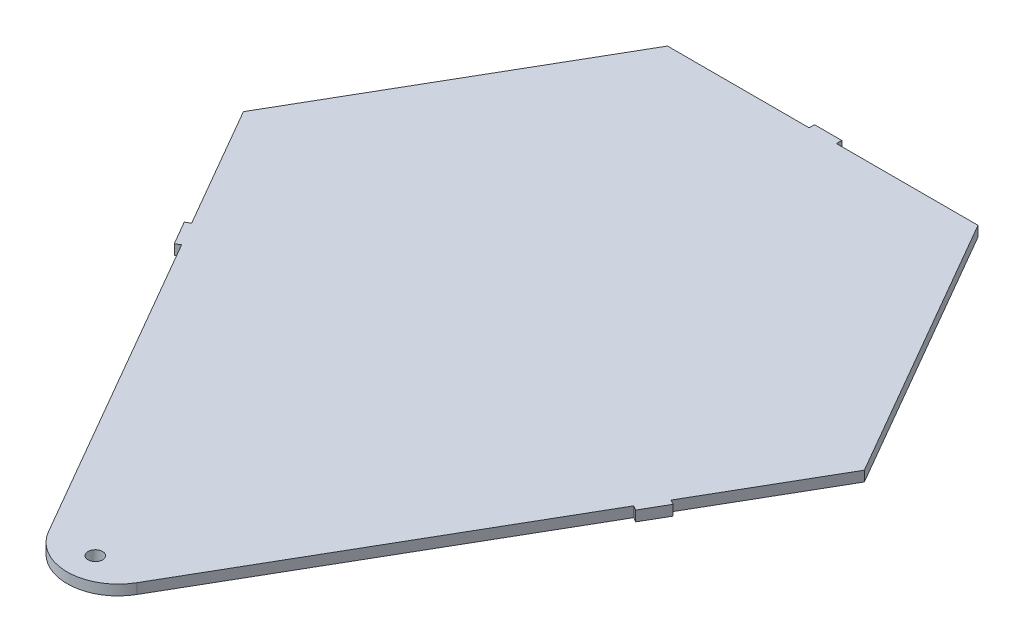
ISO-10303-21;
HEADER;
FILE_DESCRIPTION(('STEP AP214'),'2;1');
FILE_NAME('part.step','',(''),(''),'','','');
FILE_SCHEMA(('AUTOMOTIVE_DESIGN { 1 0 10303 214 1 1 1 1 }'));
ENDSEC;
DATA;
#1=APPLICATION_CONTEXT('core data for automotive mechanical design processes');
#2=APPLICATION_PROTOCOL_DEFINITION('international standard','automotive_design',2000,#1);
#3=PRODUCT_CONTEXT('',#1,'mechanical');
#4=PRODUCT('Part','Part','',(#3));
#5=PRODUCT_RELATED_PRODUCT_CATEGORY('part','',(#4));
#6=PRODUCT_DEFINITION_FORMATION('','',#4);
#7=PRODUCT_DEFINITION_CONTEXT('part definition',#1,'design');
#8=PRODUCT_DEFINITION('design','',#6,#7);
#9=PRODUCT_DEFINITION_SHAPE('','',#8);
#10=(LENGTH_UNIT() NAMED_UNIT(*) SI_UNIT(.MILLI.,.METRE.));
#11=(NAMED_UNIT(*) PLANE_ANGLE_UNIT() SI_UNIT($,.RADIAN.));
#12=(NAMED_UNIT(*) SI_UNIT($,.STERADIAN.) SOLID_ANGLE_UNIT());
#13=UNCERTAINTY_MEASURE_WITH_UNIT(LENGTH_MEASURE(1.E-05),#10,'distance_accuracy_value','');
#14=(GEOMETRIC_REPRESENTATION_CONTEXT(3) GLOBAL_UNCERTAINTY_ASSIGNED_CONTEXT((#13)) GLOBAL_UNIT_ASSIGNED_CONTEXT((#10,
#11,#12)) REPRESENTATION_CONTEXT('',''));
#15=CARTESIAN_POINT('',(0.,0.,0.));
#16=DIRECTION('',(0.,0.,1.));
#17=DIRECTION('',(1.,0.,0.));
#18=AXIS2_PLACEMENT_3D('',#15,#16,#17);
#19=CARTESIAN_POINT('',(-7.49999999999993,5.63,-147.657331345247));
#20=DIRECTION('',(0.,0.,1.));
#21=DIRECTION('',(1.,0.,0.));
#22=AXIS2_PLACEMENT_3D('',#19,#20,#21);
#23=PLANE('',#22);
#24=DIRECTION('',(-1.,0.,0.));
#25=VECTOR('',#24,1.);
#26=CARTESIAN_POINT('',(-7.49999999999993,0.,-147.657331345247));
#27=LINE('',#26,#25);
#28=CARTESIAN_POINT('',(-7.49999999999993,0.,-147.657331345247));
#29=VERTEX_POINT('',#28);
#30=CARTESIAN_POINT('',(-85.2499999999999,0.,-147.657331345247));
#31=VERTEX_POINT('',#30);
#32=EDGE_CURVE('E183',#29,#31,#27,.T.);
#33=ORIENTED_EDGE('',*,*,#32,.T.);
#34=DIRECTION('',(0.,-1.,0.));
#35=VECTOR('',#34,1.);
#36=CARTESIAN_POINT('',(-85.2499999999999,5.63,-147.657331345247));
#37=LINE('',#36,#35);
#38=CARTESIAN_POINT('',(-85.2499999999999,5.63,-147.657331345247));
#39=VERTEX_POINT('',#38);
#40=EDGE_CURVE('E164',#39,#31,#37,.T.);
#41=ORIENTED_EDGE('',*,*,#40,.F.);
#42=DIRECTION('',(-1.,0.,0.));
#43=VECTOR('',#42,1.);
#44=CARTESIAN_POINT('',(-7.49999999999993,5.63,-147.657331345247));
#45=LINE('',#44,#43);
#46=CARTESIAN_POINT('',(-7.49999999999993,5.63,-147.657331345247));
#47=VERTEX_POINT('',#46);
#48=EDGE_CURVE('E171',#47,#39,#45,.T.);
#49=ORIENTED_EDGE('',*,*,#48,.F.);
#50=DIRECTION('',(0.,-1.,0.));
#51=VECTOR('',#50,1.);
#52=CARTESIAN_POINT('',(-7.49999999999993,5.63,-147.657331345247));
#53=LINE('',#52,#51);
#54=EDGE_CURVE('E229',#47,#29,#53,.T.);
#55=ORIENTED_EDGE('',*,*,#54,.T.);
#56=EDGE_LOOP('',(#33,#41,#49,#55));
#57=FACE_BOUND('',#56,.T.);
#58=ADVANCED_FACE('F35',(#57),#23,.F.);
#59=CARTESIAN_POINT('',(-85.2499999999999,5.63,-147.657331345247));
#60=DIRECTION('',(0.866025403784438,0.,0.5));
#61=DIRECTION('',(0.5,0.,-0.866025403784438));
#62=AXIS2_PLACEMENT_3D('',#59,#60,#61);
#63=PLANE('',#62);
#64=DIRECTION('',(-0.5,0.,0.866025403784438));
#65=VECTOR('',#64,1.);
#66=CARTESIAN_POINT('',(-85.2499999999999,0.,-147.657331345247));
#67=LINE('',#66,#65);
#68=CARTESIAN_POINT('',(-170.5,0.,0.));
#69=VERTEX_POINT('',#68);
#70=EDGE_CURVE('E264',#31,#69,#67,.T.);
#71=ORIENTED_EDGE('',*,*,#70,.T.);
#72=DIRECTION('',(0.,-1.,0.));
#73=VECTOR('',#72,1.);
#74=CARTESIAN_POINT('',(-170.5,5.63,0.));
#75=LINE('',#74,#73);
#76=CARTESIAN_POINT('',(-170.5,5.63,0.));
#77=VERTEX_POINT('',#76);
#78=EDGE_CURVE('E167',#77,#69,#75,.T.);
#79=ORIENTED_EDGE('',*,*,#78,.F.);
#80=DIRECTION('',(-0.5,0.,0.866025403784438));
#81=VECTOR('',#80,1.);
#82=CARTESIAN_POINT('',(-85.2499999999999,5.63,-147.657331345247));
#83=LINE('',#82,#81);
#84=EDGE_CURVE('E160',#39,#77,#83,.T.);
#85=ORIENTED_EDGE('',*,*,#84,.F.);
#86=ORIENTED_EDGE('',*,*,#40,.T.);
#87=EDGE_LOOP('',(#71,#79,#85,#86));
#88=FACE_BOUND('',#87,.T.);
#89=ADVANCED_FACE('F162',(#88),#63,.F.);
#90=CARTESIAN_POINT('',(-170.5,5.63,0.));
#91=DIRECTION('',(0.866025403784439,0.,-0.499999999999999));
#92=DIRECTION('',(-0.499999999999999,0.,-0.866025403784439));
#93=AXIS2_PLACEMENT_3D('',#90,#91,#92);
#94=PLANE('',#93);
#95=DIRECTION('',(0.499999999999999,0.,0.866025403784439));
#96=VECTOR('',#95,1.);
#97=CARTESIAN_POINT('',(-170.5,0.,0.));
#98=LINE('',#97,#96);
#99=CARTESIAN_POINT('',(-131.650528172288,0.,67.2892590528124));
#100=VERTEX_POINT('',#99);
#101=EDGE_CURVE('E262',#69,#100,#98,.T.);
#102=ORIENTED_EDGE('',*,*,#101,.T.);
#103=DIRECTION('',(0.,-1.,0.));
#104=VECTOR('',#103,1.);
#105=CARTESIAN_POINT('',(-131.650528172288,5.63,67.2892590528124));
#106=LINE('',#105,#104);
#107=CARTESIAN_POINT('',(-131.650528172288,5.63,67.2892590528124));
#108=VERTEX_POINT('',#107);
#109=EDGE_CURVE('E188',#108,#100,#106,.T.);
#110=ORIENTED_EDGE('',*,*,#109,.F.);
#111=DIRECTION('',(0.499999999999999,0.,0.866025403784439));
#112=VECTOR('',#111,1.);
#113=CARTESIAN_POINT('',(-170.5,5.63,0.));
#114=LINE('',#113,#112);
#115=EDGE_CURVE('E170',#77,#108,#114,.T.);
#116=ORIENTED_EDGE('',*,*,#115,.F.);
#117=ORIENTED_EDGE('',*,*,#78,.T.);
#118=EDGE_LOOP('',(#102,#110,#116,#117));
#119=FACE_BOUND('',#118,.T.);
#120=ADVANCED_FACE('F332',(#119),#94,.F.);
#121=CARTESIAN_POINT('',(-131.650528172288,5.63,67.2892590528124));
#122=DIRECTION('',(0.499999999999997,0.,0.86602540378444));
#123=DIRECTION('',(0.86602540378444,0.,-0.499999999999997));
#124=AXIS2_PLACEMENT_3D('',#121,#122,#123);
#125=PLANE('',#124);
#126=DIRECTION('',(-0.86602540378444,0.,0.499999999999997));
#127=VECTOR('',#126,1.);
#128=CARTESIAN_POINT('',(-131.650528172288,0.,67.2892590528124));
#129=LINE('',#128,#127);
#130=CARTESIAN_POINT('',(-134.205303113452,0.,68.7642590528123));
#131=VERTEX_POINT('',#130);
#132=EDGE_CURVE('E260',#100,#131,#129,.T.);
#133=ORIENTED_EDGE('',*,*,#132,.T.);
#134=DIRECTION('',(0.,-1.,0.));
#135=VECTOR('',#134,1.);
#136=CARTESIAN_POINT('',(-134.205303113452,5.63,68.7642590528123));
#137=LINE('',#136,#135);
#138=CARTESIAN_POINT('',(-134.205303113452,5.63,68.7642590528123));
#139=VERTEX_POINT('',#138);
#140=EDGE_CURVE('E195',#139,#131,#137,.T.);
#141=ORIENTED_EDGE('',*,*,#140,.F.);
#142=DIRECTION('',(-0.86602540378444,0.,0.499999999999997));
#143=VECTOR('',#142,1.);
#144=CARTESIAN_POINT('',(-131.650528172288,5.63,67.2892590528124));
#145=LINE('',#144,#143);
#146=EDGE_CURVE('E294',#108,#139,#145,.T.);
#147=ORIENTED_EDGE('',*,*,#146,.F.);
#148=ORIENTED_EDGE('',*,*,#109,.T.);
#149=EDGE_LOOP('',(#133,#141,#147,#148));
#150=FACE_BOUND('',#149,.T.);
#151=ADVANCED_FACE('F337',(#150),#125,.F.);
#152=CARTESIAN_POINT('',(-134.205303113452,5.63,68.7642590528123));
#153=DIRECTION('',(0.866025403784439,0.,-0.5));
#154=DIRECTION('',(-0.5,0.,-0.866025403784439));
#155=AXIS2_PLACEMENT_3D('',#152,#153,#154);
#156=PLANE('',#155);
#157=DIRECTION('',(0.5,0.,0.866025403784439));
#158=VECTOR('',#157,1.);
#159=CARTESIAN_POINT('',(-134.205303113452,0.,68.7642590528123));
#160=LINE('',#159,#158);
#161=CARTESIAN_POINT('',(-126.705303113452,0.,81.7546401095789));
#162=VERTEX_POINT('',#161);
#163=EDGE_CURVE('E258',#131,#162,#160,.T.);
#164=ORIENTED_EDGE('',*,*,#163,.T.);
#165=DIRECTION('',(0.,-1.,0.));
#166=VECTOR('',#165,1.);
#167=CARTESIAN_POINT('',(-126.705303113452,5.63,81.7546401095789));
#168=LINE('',#167,#166);
#169=CARTESIAN_POINT('',(-126.705303113452,5.63,81.7546401095789));
#170=VERTEX_POINT('',#169);
#171=EDGE_CURVE('E198',#170,#162,#168,.T.);
#172=ORIENTED_EDGE('',*,*,#171,.F.);
#173=DIRECTION('',(0.5,0.,0.866025403784439));
#174=VECTOR('',#173,1.);
#175=CARTESIAN_POINT('',(-134.205303113452,5.63,68.7642590528123));
#176=LINE('',#175,#174);
#177=EDGE_CURVE('E292',#139,#170,#176,.T.);
#178=ORIENTED_EDGE('',*,*,#177,.F.);
#179=ORIENTED_EDGE('',*,*,#140,.T.);
#180=EDGE_LOOP('',(#164,#172,#178,#179));
#181=FACE_BOUND('',#180,.T.);
#182=ADVANCED_FACE('F341',(#181),#156,.F.);
#183=CARTESIAN_POINT('',(-126.705303113452,5.63,81.7546401095789));
#184=DIRECTION('',(-0.500000000000003,0.,-0.866025403784437));
#185=DIRECTION('',(-0.866025403784437,0.,0.500000000000003));
#186=AXIS2_PLACEMENT_3D('',#183,#184,#185);
#187=PLANE('',#186);
#188=DIRECTION('',(0.866025403784437,0.,-0.500000000000003));
#189=VECTOR('',#188,1.);
#190=CARTESIAN_POINT('',(-126.705303113452,0.,81.7546401095789));
#191=LINE('',#190,#189);
#192=CARTESIAN_POINT('',(-124.150528172288,0.,80.2796401095789));
#193=VERTEX_POINT('',#192);
#194=EDGE_CURVE('E255',#162,#193,#191,.T.);
#195=ORIENTED_EDGE('',*,*,#194,.T.);
#196=DIRECTION('',(0.,-1.,0.));
#197=VECTOR('',#196,1.);
#198=CARTESIAN_POINT('',(-124.150528172288,5.63,80.2796401095789));
#199=LINE('',#198,#197);
#200=CARTESIAN_POINT('',(-124.150528172288,5.63,80.2796401095789));
#201=VERTEX_POINT('',#200);
#202=EDGE_CURVE('E201',#201,#193,#199,.T.);
#203=ORIENTED_EDGE('',*,*,#202,.F.);
#204=DIRECTION('',(0.866025403784437,0.,-0.500000000000003));
#205=VECTOR('',#204,1.);
#206=CARTESIAN_POINT('',(-126.705303113452,5.63,81.7546401095789));
#207=LINE('',#206,#205);
#208=EDGE_CURVE('E290',#170,#201,#207,.T.);
#209=ORIENTED_EDGE('',*,*,#208,.F.);
#210=ORIENTED_EDGE('',*,*,#171,.T.);
#211=EDGE_LOOP('',(#195,#203,#209,#210));
#212=FACE_BOUND('',#211,.T.);
#213=ADVANCED_FACE('F345',(#212),#187,.F.);
#214=CARTESIAN_POINT('',(-85.2499999999848,5.63,147.657331345273));
#215=DIRECTION('',(0.866025403784438,0.,-0.5));
#216=DIRECTION('',(-0.5,0.,-0.866025403784438));
#217=AXIS2_PLACEMENT_3D('',#214,#215,#216);
#218=PLANE('',#217);
#219=DIRECTION('',(0.5,0.,0.866025403784438));
#220=VECTOR('',#219,1.);
#221=CARTESIAN_POINT('',(-85.2499999999848,0.,147.657331345273));
#222=LINE('',#221,#220);
#223=CARTESIAN_POINT('',(-24.2487113059642,0.,253.314662690493));
#224=VERTEX_POINT('',#223);
#225=EDGE_CURVE('E253',#193,#224,#222,.T.);
#226=ORIENTED_EDGE('',*,*,#225,.T.);
#227=DIRECTION('',(0.,-1.,0.));
#228=VECTOR('',#227,1.);
#229=CARTESIAN_POINT('',(-24.2487113059642,5.63,253.314662690493));
#230=LINE('',#229,#228);
#231=CARTESIAN_POINT('',(-24.2487113059641,5.63,253.314662690493));
#232=VERTEX_POINT('',#231);
#233=EDGE_CURVE('E44',#224,#232,#230,.F.);
#234=ORIENTED_EDGE('',*,*,#233,.T.);
#235=DIRECTION('',(0.500000000000002,0.,0.866025403784437));
#236=VECTOR('',#235,1.);
#237=CARTESIAN_POINT('',(-124.150528172288,5.63,80.2796401095789));
#238=LINE('',#237,#236);
#239=EDGE_CURVE('E288',#201,#232,#238,.T.);
#240=ORIENTED_EDGE('',*,*,#239,.F.);
#241=ORIENTED_EDGE('',*,*,#202,.T.);
#242=EDGE_LOOP('',(#226,#234,#240,#241));
#243=FACE_BOUND('',#242,.T.);
#244=ADVANCED_FACE('F349',(#243),#218,.F.);
#245=CARTESIAN_POINT('',(85.25,5.63,147.657331345247));
#246=DIRECTION('',(-0.866025403784438,0.,-0.500000000000001));
#247=DIRECTION('',(-0.500000000000001,0.,0.866025403784438));
#248=AXIS2_PLACEMENT_3D('',#245,#246,#247);
#249=PLANE('',#248);
#250=DIRECTION('',(-0.499999999999999,0.,0.866025403784439));
#251=VECTOR('',#250,1.);
#252=CARTESIAN_POINT('',(85.25,5.63,147.657331345247));
#253=LINE('',#252,#251);
#254=CARTESIAN_POINT('',(124.150528172288,5.63,80.2796401095789));
#255=VERTEX_POINT('',#254);
#256=CARTESIAN_POINT('',(24.2487113059645,5.63,253.314662690494));
#257=VERTEX_POINT('',#256);
#258=EDGE_CURVE('E285',#255,#257,#253,.T.);
#259=ORIENTED_EDGE('',*,*,#258,.T.);
#260=DIRECTION('',(0.,-1.,0.));
#261=VECTOR('',#260,1.);
#262=CARTESIAN_POINT('',(24.2487113059643,5.63,253.314662690493));
#263=LINE('',#262,#261);
#264=CARTESIAN_POINT('',(24.2487113059643,0.,253.314662690493));
#265=VERTEX_POINT('',#264);
#266=EDGE_CURVE('E184',#257,#265,#263,.T.);
#267=ORIENTED_EDGE('',*,*,#266,.T.);
#268=DIRECTION('',(0.500000000000001,0.,-0.866025403784438));
#269=VECTOR('',#268,1.);
#270=CARTESIAN_POINT('',(85.25,0.,147.657331345247));
#271=LINE('',#270,#269);
#272=CARTESIAN_POINT('',(124.150528172288,0.,80.2796401095789));
#273=VERTEX_POINT('',#272);
#274=EDGE_CURVE('E251',#265,#273,#271,.T.);
#275=ORIENTED_EDGE('',*,*,#274,.T.);
#276=DIRECTION('',(0.,-1.,0.));
#277=VECTOR('',#276,1.);
#278=CARTESIAN_POINT('',(124.150528172288,5.63,80.2796401095789));
#279=LINE('',#278,#277);
#280=EDGE_CURVE('E204',#255,#273,#279,.T.);
#281=ORIENTED_EDGE('',*,*,#280,.F.);
#282=EDGE_LOOP('',(#259,#267,#275,#281));
#283=FACE_BOUND('',#282,.T.);
#284=ADVANCED_FACE('F313',(#283),#249,.F.);
#285=CARTESIAN_POINT('',(124.150528172288,5.63,80.2796401095789));
#286=DIRECTION('',(0.500000000000002,0.,-0.866025403784438));
#287=DIRECTION('',(-0.866025403784438,0.,-0.500000000000002));
#288=AXIS2_PLACEMENT_3D('',#285,#286,#287);
#289=PLANE('',#288);
#290=DIRECTION('',(0.866025403784438,0.,0.500000000000002));
#291=VECTOR('',#290,1.);
#292=CARTESIAN_POINT('',(124.150528172288,0.,80.2796401095789));
#293=LINE('',#292,#291);
#294=CARTESIAN_POINT('',(126.705303113453,0.,81.7546401095789));
#295=VERTEX_POINT('',#294);
#296=EDGE_CURVE('E249',#273,#295,#293,.T.);
#297=ORIENTED_EDGE('',*,*,#296,.T.);
#298=DIRECTION('',(0.,-1.,0.));
#299=VECTOR('',#298,1.);
#300=CARTESIAN_POINT('',(126.705303113453,5.63,81.7546401095789));
#301=LINE('',#300,#299);
#302=CARTESIAN_POINT('',(126.705303113453,5.63,81.7546401095789));
#303=VERTEX_POINT('',#302);
#304=EDGE_CURVE('E207',#303,#295,#301,.T.);
#305=ORIENTED_EDGE('',*,*,#304,.F.);
#306=DIRECTION('',(0.866025403784438,0.,0.500000000000002));
#307=VECTOR('',#306,1.);
#308=CARTESIAN_POINT('',(124.150528172288,5.63,80.2796401095789));
#309=LINE('',#308,#307);
#310=EDGE_CURVE('E283',#255,#303,#309,.T.);
#311=ORIENTED_EDGE('',*,*,#310,.F.);
#312=ORIENTED_EDGE('',*,*,#280,.T.);
#313=EDGE_LOOP('',(#297,#305,#311,#312));
#314=FACE_BOUND('',#313,.T.);
#315=ADVANCED_FACE('F317',(#314),#289,.F.);
#316=CARTESIAN_POINT('',(126.705303113453,5.63,81.7546401095789));
#317=DIRECTION('',(-0.866025403784439,0.,-0.5));
#318=DIRECTION('',(-0.5,0.,0.866025403784439));
#319=AXIS2_PLACEMENT_3D('',#316,#317,#318);
#320=PLANE('',#319);
#321=DIRECTION('',(0.5,0.,-0.866025403784439));
#322=VECTOR('',#321,1.);
#323=CARTESIAN_POINT('',(126.705303113453,0.,81.7546401095789));
#324=LINE('',#323,#322);
#325=CARTESIAN_POINT('',(134.205303113453,0.,68.7642590528123));
#326=VERTEX_POINT('',#325);
#327=EDGE_CURVE('E247',#295,#326,#324,.T.);
#328=ORIENTED_EDGE('',*,*,#327,.T.);
#329=DIRECTION('',(0.,-1.,0.));
#330=VECTOR('',#329,1.);
#331=CARTESIAN_POINT('',(134.205303113453,5.63,68.7642590528123));
#332=LINE('',#331,#330);
#333=CARTESIAN_POINT('',(134.205303113453,5.63,68.7642590528123));
#334=VERTEX_POINT('',#333);
#335=EDGE_CURVE('E210',#334,#326,#332,.T.);
#336=ORIENTED_EDGE('',*,*,#335,.F.);
#337=DIRECTION('',(0.5,0.,-0.866025403784439));
#338=VECTOR('',#337,1.);
#339=CARTESIAN_POINT('',(126.705303113453,5.63,81.7546401095789));
#340=LINE('',#339,#338);
#341=EDGE_CURVE('E281',#303,#334,#340,.T.);
#342=ORIENTED_EDGE('',*,*,#341,.F.);
#343=ORIENTED_EDGE('',*,*,#304,.T.);
#344=EDGE_LOOP('',(#328,#336,#342,#343));
#345=FACE_BOUND('',#344,.T.);
#346=ADVANCED_FACE('F357',(#345),#320,.F.);
#347=CARTESIAN_POINT('',(134.205303113453,5.63,68.7642590528123));
#348=DIRECTION('',(-0.499999999999996,0.,0.866025403784441));
#349=DIRECTION('',(0.866025403784441,0.,0.499999999999996));
#350=AXIS2_PLACEMENT_3D('',#347,#348,#349);
#351=PLANE('',#350);
#352=DIRECTION('',(-0.866025403784441,0.,-0.499999999999996));
#353=VECTOR('',#352,1.);
#354=CARTESIAN_POINT('',(134.205303113453,0.,68.7642590528123));
#355=LINE('',#354,#353);
#356=CARTESIAN_POINT('',(131.650528172288,0.,67.2892590528123));
#357=VERTEX_POINT('',#356);
#358=EDGE_CURVE('E245',#326,#357,#355,.T.);
#359=ORIENTED_EDGE('',*,*,#358,.T.);
#360=DIRECTION('',(0.,-1.,0.));
#361=VECTOR('',#360,1.);
#362=CARTESIAN_POINT('',(131.650528172288,5.63,67.2892590528123));
#363=LINE('',#362,#361);
#364=CARTESIAN_POINT('',(131.650528172288,5.63,67.2892590528123));
#365=VERTEX_POINT('',#364);
#366=EDGE_CURVE('E213',#365,#357,#363,.T.);
#367=ORIENTED_EDGE('',*,*,#366,.F.);
#368=DIRECTION('',(-0.866025403784441,0.,-0.499999999999996));
#369=VECTOR('',#368,1.);
#370=CARTESIAN_POINT('',(134.205303113453,5.63,68.7642590528123));
#371=LINE('',#370,#369);
#372=EDGE_CURVE('E279',#334,#365,#371,.T.);
#373=ORIENTED_EDGE('',*,*,#372,.F.);
#374=ORIENTED_EDGE('',*,*,#335,.T.);
#375=EDGE_LOOP('',(#359,#367,#373,#374));
#376=FACE_BOUND('',#375,.T.);
#377=ADVANCED_FACE('F360',(#376),#351,.F.);
#378=CARTESIAN_POINT('',(131.650528172288,5.63,67.2892590528123));
#379=DIRECTION('',(-0.866025403784439,0.,-0.5));
#380=DIRECTION('',(-0.5,0.,0.866025403784439));
#381=AXIS2_PLACEMENT_3D('',#378,#379,#380);
#382=PLANE('',#381);
#383=DIRECTION('',(0.5,0.,-0.866025403784439));
#384=VECTOR('',#383,1.);
#385=CARTESIAN_POINT('',(131.650528172288,0.,67.2892590528123));
#386=LINE('',#385,#384);
#387=CARTESIAN_POINT('',(170.5,0.,0.));
#388=VERTEX_POINT('',#387);
#389=EDGE_CURVE('E243',#357,#388,#386,.T.);
#390=ORIENTED_EDGE('',*,*,#389,.T.);
#391=DIRECTION('',(0.,-1.,0.));
#392=VECTOR('',#391,1.);
#393=CARTESIAN_POINT('',(170.5,5.63,0.));
#394=LINE('',#393,#392);
#395=CARTESIAN_POINT('',(170.5,5.63,0.));
#396=VERTEX_POINT('',#395);
#397=EDGE_CURVE('E216',#396,#388,#394,.T.);
#398=ORIENTED_EDGE('',*,*,#397,.F.);
#399=DIRECTION('',(0.5,0.,-0.866025403784439));
#400=VECTOR('',#399,1.);
#401=CARTESIAN_POINT('',(131.650528172288,5.63,67.2892590528123));
#402=LINE('',#401,#400);
#403=EDGE_CURVE('E277',#365,#396,#402,.T.);
#404=ORIENTED_EDGE('',*,*,#403,.F.);
#405=ORIENTED_EDGE('',*,*,#366,.T.);
#406=EDGE_LOOP('',(#390,#398,#404,#405));
#407=FACE_BOUND('',#406,.T.);
#408=ADVANCED_FACE('F364',(#407),#382,.F.);
#409=CARTESIAN_POINT('',(170.5,5.63,0.));
#410=DIRECTION('',(-0.866025403784439,0.,0.5));
#411=DIRECTION('',(0.5,0.,0.866025403784439));
#412=AXIS2_PLACEMENT_3D('',#409,#410,#411);
#413=PLANE('',#412);
#414=DIRECTION('',(-0.5,0.,-0.866025403784439));
#415=VECTOR('',#414,1.);
#416=CARTESIAN_POINT('',(170.5,0.,0.));
#417=LINE('',#416,#415);
#418=CARTESIAN_POINT('',(85.2500000000001,0.,-147.657331345247));
#419=VERTEX_POINT('',#418);
#420=EDGE_CURVE('E241',#388,#419,#417,.T.);
#421=ORIENTED_EDGE('',*,*,#420,.T.);
#422=DIRECTION('',(0.,-1.,0.));
#423=VECTOR('',#422,1.);
#424=CARTESIAN_POINT('',(85.2500000000001,5.63,-147.657331345247));
#425=LINE('',#424,#423);
#426=CARTESIAN_POINT('',(85.2500000000001,5.63,-147.657331345247));
#427=VERTEX_POINT('',#426);
#428=EDGE_CURVE('E219',#427,#419,#425,.T.);
#429=ORIENTED_EDGE('',*,*,#428,.F.);
#430=DIRECTION('',(-0.5,0.,-0.866025403784439));
#431=VECTOR('',#430,1.);
#432=CARTESIAN_POINT('',(170.5,5.63,0.));
#433=LINE('',#432,#431);
#434=EDGE_CURVE('E275',#396,#427,#433,.T.);
#435=ORIENTED_EDGE('',*,*,#434,.F.);
#436=ORIENTED_EDGE('',*,*,#397,.T.);
#437=EDGE_LOOP('',(#421,#429,#435,#436));
#438=FACE_BOUND('',#437,.T.);
#439=ADVANCED_FACE('F368',(#438),#413,.F.);
#440=CARTESIAN_POINT('',(85.2500000000001,5.63,-147.657331345247));
#441=DIRECTION('',(0.,0.,1.));
#442=DIRECTION('',(1.,0.,0.));
#443=AXIS2_PLACEMENT_3D('',#440,#441,#442);
#444=PLANE('',#443);
#445=DIRECTION('',(-1.,0.,0.));
#446=VECTOR('',#445,1.);
#447=CARTESIAN_POINT('',(85.2500000000001,0.,-147.657331345247));
#448=LINE('',#447,#446);
#449=CARTESIAN_POINT('',(7.50000000000007,0.,-147.657331345247));
#450=VERTEX_POINT('',#449);
#451=EDGE_CURVE('E239',#419,#450,#448,.T.);
#452=ORIENTED_EDGE('',*,*,#451,.T.);
#453=DIRECTION('',(0.,-1.,0.));
#454=VECTOR('',#453,1.);
#455=CARTESIAN_POINT('',(7.50000000000007,5.63,-147.657331345247));
#456=LINE('',#455,#454);
#457=CARTESIAN_POINT('',(7.50000000000007,5.63,-147.657331345247));
#458=VERTEX_POINT('',#457);
#459=EDGE_CURVE('E222',#458,#450,#456,.T.);
#460=ORIENTED_EDGE('',*,*,#459,.F.);
#461=DIRECTION('',(-1.,0.,0.));
#462=VECTOR('',#461,1.);
#463=CARTESIAN_POINT('',(85.2500000000001,5.63,-147.657331345247));
#464=LINE('',#463,#462);
#465=EDGE_CURVE('E273',#427,#458,#464,.T.);
#466=ORIENTED_EDGE('',*,*,#465,.F.);
#467=ORIENTED_EDGE('',*,*,#428,.T.);
#468=EDGE_LOOP('',(#452,#460,#466,#467));
#469=FACE_BOUND('',#468,.T.);
#470=ADVANCED_FACE('F372',(#469),#444,.F.);
#471=CARTESIAN_POINT('',(7.50000000000007,5.63,-147.657331345247));
#472=DIRECTION('',(-1.,0.,0.));
#473=DIRECTION('',(0.,0.,1.));
#474=AXIS2_PLACEMENT_3D('',#471,#472,#473);
#475=PLANE('',#474);
#476=DIRECTION('',(0.,0.,-1.));
#477=VECTOR('',#476,1.);
#478=CARTESIAN_POINT('',(7.50000000000007,0.,-147.657331345247));
#479=LINE('',#478,#477);
#480=CARTESIAN_POINT('',(7.50000000000007,0.,-150.607331345247));
#481=VERTEX_POINT('',#480);
#482=EDGE_CURVE('E236',#450,#481,#479,.T.);
#483=ORIENTED_EDGE('',*,*,#482,.T.);
#484=DIRECTION('',(0.,-1.,0.));
#485=VECTOR('',#484,1.);
#486=CARTESIAN_POINT('',(7.50000000000007,5.63,-150.607331345247));
#487=LINE('',#486,#485);
#488=CARTESIAN_POINT('',(7.50000000000007,5.63,-150.607331345247));
#489=VERTEX_POINT('',#488);
#490=EDGE_CURVE('E225',#489,#481,#487,.T.);
#491=ORIENTED_EDGE('',*,*,#490,.F.);
#492=DIRECTION('',(0.,0.,-1.));
#493=VECTOR('',#492,1.);
#494=CARTESIAN_POINT('',(7.50000000000007,5.63,-147.657331345247));
#495=LINE('',#494,#493);
#496=EDGE_CURVE('E271',#458,#489,#495,.T.);
#497=ORIENTED_EDGE('',*,*,#496,.F.);
#498=ORIENTED_EDGE('',*,*,#459,.T.);
#499=EDGE_LOOP('',(#483,#491,#497,#498));
#500=FACE_BOUND('',#499,.T.);
#501=ADVANCED_FACE('F376',(#500),#475,.F.);
#502=CARTESIAN_POINT('',(-7.49999999999993,5.63,-150.607331345247));
#503=DIRECTION('',(0.,0.,-1.));
#504=DIRECTION('',(-1.,0.,0.));
#505=AXIS2_PLACEMENT_3D('',#502,#503,#504);
#506=PLANE('',#505);
#507=DIRECTION('',(1.,0.,0.));
#508=VECTOR('',#507,1.);
#509=CARTESIAN_POINT('',(-7.49999999999993,0.,-150.607331345247));
#510=LINE('',#509,#508);
#511=CARTESIAN_POINT('',(-7.49999999999993,0.,-150.607331345247));
#512=VERTEX_POINT('',#511);
#513=EDGE_CURVE('E233',#512,#481,#510,.T.);
#514=ORIENTED_EDGE('',*,*,#513,.F.);
#515=DIRECTION('',(0.,-1.,0.));
#516=VECTOR('',#515,1.);
#517=CARTESIAN_POINT('',(-7.49999999999993,5.63,-150.607331345247));
#518=LINE('',#517,#516);
#519=CARTESIAN_POINT('',(-7.49999999999993,5.63,-150.607331345247));
#520=VERTEX_POINT('',#519);
#521=EDGE_CURVE('E227',#520,#512,#518,.T.);
#522=ORIENTED_EDGE('',*,*,#521,.F.);
#523=DIRECTION('',(1.,0.,0.));
#524=VECTOR('',#523,1.);
#525=CARTESIAN_POINT('',(-7.49999999999993,5.63,-150.607331345247));
#526=LINE('',#525,#524);
#527=EDGE_CURVE('E268',#520,#489,#526,.T.);
#528=ORIENTED_EDGE('',*,*,#527,.T.);
#529=ORIENTED_EDGE('',*,*,#490,.T.);
#530=EDGE_LOOP('',(#514,#522,#528,#529));
#531=FACE_BOUND('',#530,.T.);
#532=ADVANCED_FACE('F380',(#531),#506,.T.);
#533=CARTESIAN_POINT('',(-7.49999999999993,5.63,-147.657331345247));
#534=DIRECTION('',(-1.,0.,0.));
#535=DIRECTION('',(0.,0.,1.));
#536=AXIS2_PLACEMENT_3D('',#533,#534,#535);
#537=PLANE('',#536);
#538=DIRECTION('',(0.,0.,-1.));
#539=VECTOR('',#538,1.);
#540=CARTESIAN_POINT('',(-7.49999999999993,0.,-147.657331345247));
#541=LINE('',#540,#539);
#542=EDGE_CURVE('E180',#29,#512,#541,.T.);
#543=ORIENTED_EDGE('',*,*,#542,.F.);
#544=ORIENTED_EDGE('',*,*,#54,.F.);
#545=DIRECTION('',(0.,0.,-1.));
#546=VECTOR('',#545,1.);
#547=CARTESIAN_POINT('',(-7.49999999999993,5.63,-147.657331345247));
#548=LINE('',#547,#546);
#549=EDGE_CURVE('E178',#47,#520,#548,.T.);
#550=ORIENTED_EDGE('',*,*,#549,.T.);
#551=ORIENTED_EDGE('',*,*,#521,.T.);
#552=EDGE_LOOP('',(#543,#544,#550,#551));
#553=FACE_BOUND('',#552,.T.);
#554=ADVANCED_FACE('F384',(#553),#537,.T.);
#555=CARTESIAN_POINT('',(0.,5.63,0.));
#556=DIRECTION('',(0.,-1.,0.));
#557=DIRECTION('',(0.,0.,-1.));
#558=AXIS2_PLACEMENT_3D('',#555,#556,#557);
#559=PLANE('',#558);
#560=CARTESIAN_POINT('',(0.,5.63,251.834791553875));
#561=DIRECTION('',(0.,1.,0.));
#562=DIRECTION('',(0.,0.,1.));
#563=AXIS2_PLACEMENT_3D('',#560,#561,#562);
#564=CIRCLE('',#563,4.);
#565=CARTESIAN_POINT('',(0.,5.63,255.834791553875));
#566=VERTEX_POINT('',#565);
#567=EDGE_CURVE('E297',#566,#566,#564,.T.);
#568=ORIENTED_EDGE('',*,*,#567,.F.);
#569=EDGE_LOOP('',(#568));
#570=FACE_BOUND('',#569,.T.);
#571=ORIENTED_EDGE('',*,*,#239,.T.);
#572=CARTESIAN_POINT('',(0.,5.63,239.314662690493));
#573=DIRECTION('',(0.,-1.,0.));
#574=DIRECTION('',(0.,0.,-1.));
#575=AXIS2_PLACEMENT_3D('',#572,#573,#574);
#576=CIRCLE('',#575,28.);
#577=EDGE_CURVE('E11',#232,#257,#576,.F.);
#578=ORIENTED_EDGE('',*,*,#577,.T.);
#579=ORIENTED_EDGE('',*,*,#258,.F.);
#580=ORIENTED_EDGE('',*,*,#310,.T.);
#581=ORIENTED_EDGE('',*,*,#341,.T.);
#582=ORIENTED_EDGE('',*,*,#372,.T.);
#583=ORIENTED_EDGE('',*,*,#403,.T.);
#584=ORIENTED_EDGE('',*,*,#434,.T.);
#585=ORIENTED_EDGE('',*,*,#465,.T.);
#586=ORIENTED_EDGE('',*,*,#496,.T.);
#587=ORIENTED_EDGE('',*,*,#527,.F.);
#588=ORIENTED_EDGE('',*,*,#549,.F.);
#589=ORIENTED_EDGE('',*,*,#48,.T.);
#590=ORIENTED_EDGE('',*,*,#84,.T.);
#591=ORIENTED_EDGE('',*,*,#115,.T.);
#592=ORIENTED_EDGE('',*,*,#146,.T.);
#593=ORIENTED_EDGE('',*,*,#177,.T.);
#594=ORIENTED_EDGE('',*,*,#208,.T.);
#595=EDGE_LOOP('',(#571,#578,#579,#580,#581,#582,#583,#584,#585,#586,#587,#588,#589,#590,#591,
#592,#593,#594));
#596=FACE_BOUND('',#595,.T.);
#597=ADVANCED_FACE('F175',(#570,#596),#559,.F.);
#598=CARTESIAN_POINT('',(0.,0.,0.));
#599=DIRECTION('',(0.,-1.,0.));
#600=DIRECTION('',(0.,0.,-1.));
#601=AXIS2_PLACEMENT_3D('',#598,#599,#600);
#602=PLANE('',#601);
#603=CARTESIAN_POINT('',(0.,0.,251.834791553875));
#604=DIRECTION('',(0.,-1.,0.));
#605=DIRECTION('',(0.,0.,-1.));
#606=AXIS2_PLACEMENT_3D('',#603,#604,#605);
#607=CIRCLE('',#606,4.);
#608=CARTESIAN_POINT('',(0.,0.,247.834791553875));
#609=VERTEX_POINT('',#608);
#610=EDGE_CURVE('E39',#609,#609,#607,.T.);
#611=ORIENTED_EDGE('',*,*,#610,.F.);
#612=EDGE_LOOP('',(#611));
#613=FACE_BOUND('',#612,.T.);
#614=ORIENTED_EDGE('',*,*,#274,.F.);
#615=CARTESIAN_POINT('',(0.,0.,239.314662690493));
#616=DIRECTION('',(0.,-1.,0.));
#617=DIRECTION('',(0.,0.,-1.));
#618=AXIS2_PLACEMENT_3D('',#615,#616,#617);
#619=CIRCLE('',#618,28.);
#620=EDGE_CURVE('E58',#265,#224,#619,.T.);
#621=ORIENTED_EDGE('',*,*,#620,.T.);
#622=ORIENTED_EDGE('',*,*,#225,.F.);
#623=ORIENTED_EDGE('',*,*,#194,.F.);
#624=ORIENTED_EDGE('',*,*,#163,.F.);
#625=ORIENTED_EDGE('',*,*,#132,.F.);
#626=ORIENTED_EDGE('',*,*,#101,.F.);
#627=ORIENTED_EDGE('',*,*,#70,.F.);
#628=ORIENTED_EDGE('',*,*,#32,.F.);
#629=ORIENTED_EDGE('',*,*,#542,.T.);
#630=ORIENTED_EDGE('',*,*,#513,.T.);
#631=ORIENTED_EDGE('',*,*,#482,.F.);
#632=ORIENTED_EDGE('',*,*,#451,.F.);
#633=ORIENTED_EDGE('',*,*,#420,.F.);
#634=ORIENTED_EDGE('',*,*,#389,.F.);
#635=ORIENTED_EDGE('',*,*,#358,.F.);
#636=ORIENTED_EDGE('',*,*,#327,.F.);
#637=ORIENTED_EDGE('',*,*,#296,.F.);
#638=EDGE_LOOP('',(#614,#621,#622,#623,#624,#625,#626,#627,#628,#629,#630,#631,#632,#633,#634,
#635,#636,#637));
#639=FACE_BOUND('',#638,.T.);
#640=ADVANCED_FACE('F306',(#613,#639),#602,.T.);
#641=CARTESIAN_POINT('',(0.,5.63,239.314662690493));
#642=DIRECTION('',(0.,-1.,0.));
#643=DIRECTION('',(0.,0.,-1.));
#644=AXIS2_PLACEMENT_3D('',#641,#642,#643);
#645=CYLINDRICAL_SURFACE('',#644,28.);
#646=ORIENTED_EDGE('',*,*,#577,.F.);
#647=ORIENTED_EDGE('',*,*,#233,.F.);
#648=ORIENTED_EDGE('',*,*,#620,.F.);
#649=ORIENTED_EDGE('',*,*,#266,.F.);
#650=EDGE_LOOP('',(#646,#647,#648,#649));
#651=FACE_BOUND('',#650,.T.);
#652=ADVANCED_FACE('F37',(#651),#645,.T.);
#653=CARTESIAN_POINT('',(0.,-4.37,251.834791553875));
#654=DIRECTION('',(0.,1.,0.));
#655=DIRECTION('',(0.,0.,1.));
#656=AXIS2_PLACEMENT_3D('',#653,#654,#655);
#657=CYLINDRICAL_SURFACE('',#656,4.);
#658=ORIENTED_EDGE('',*,*,#610,.T.);
#659=EDGE_LOOP('',(#658));
#660=FACE_BOUND('',#659,.T.);
#661=ORIENTED_EDGE('',*,*,#567,.T.);
#662=EDGE_LOOP('',(#661));
#663=FACE_BOUND('',#662,.T.);
#664=ADVANCED_FACE('F304',(#660,#663),#657,.F.);
#665=CLOSED_SHELL('',(#58,#89,#120,#151,#182,#213,#244,#284,#315,#346,#377,#408,#439,#470,#501,
#532,#554,#597,#640,#652,#664));
#666=MANIFOLD_SOLID_BREP('B2',#665);
#667=ADVANCED_BREP_SHAPE_REPRESENTATION('',(#18,#666),#14);
#668=SHAPE_DEFINITION_REPRESENTATION(#9,#667);
ENDSEC;
END-ISO-10303-21;
